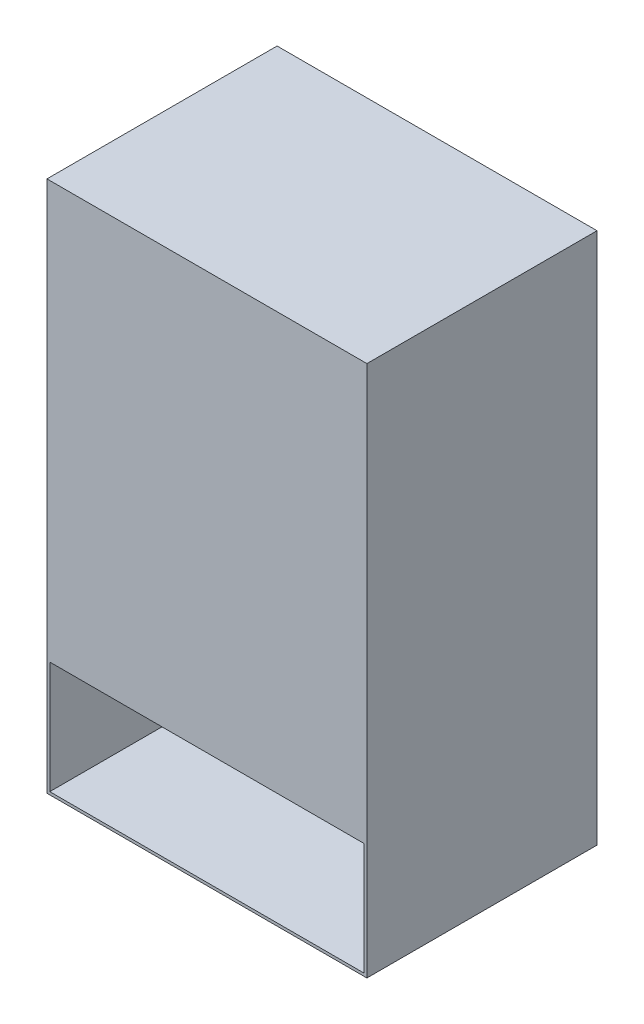
ISO-10303-21;
HEADER;
FILE_DESCRIPTION(('STEP AP214'),'2;1');
FILE_NAME('part.step','',(''),(''),'','','');
FILE_SCHEMA(('AUTOMOTIVE_DESIGN { 1 0 10303 214 1 1 1 1 }'));
ENDSEC;
DATA;
#1=APPLICATION_CONTEXT('core data for automotive mechanical design processes');
#2=APPLICATION_PROTOCOL_DEFINITION('international standard','automotive_design',2000,#1);
#3=PRODUCT_CONTEXT('',#1,'mechanical');
#4=PRODUCT('Part','Part','',(#3));
#5=PRODUCT_RELATED_PRODUCT_CATEGORY('part','',(#4));
#6=PRODUCT_DEFINITION_FORMATION('','',#4);
#7=PRODUCT_DEFINITION_CONTEXT('part definition',#1,'design');
#8=PRODUCT_DEFINITION('design','',#6,#7);
#9=PRODUCT_DEFINITION_SHAPE('','',#8);
#10=(LENGTH_UNIT() NAMED_UNIT(*) SI_UNIT(.MILLI.,.METRE.));
#11=(NAMED_UNIT(*) PLANE_ANGLE_UNIT() SI_UNIT($,.RADIAN.));
#12=(NAMED_UNIT(*) SI_UNIT($,.STERADIAN.) SOLID_ANGLE_UNIT());
#13=UNCERTAINTY_MEASURE_WITH_UNIT(LENGTH_MEASURE(1.E-05),#10,'distance_accuracy_value','');
#14=(GEOMETRIC_REPRESENTATION_CONTEXT(3) GLOBAL_UNCERTAINTY_ASSIGNED_CONTEXT((#13)) GLOBAL_UNIT_ASSIGNED_CONTEXT((#10,
#11,#12)) REPRESENTATION_CONTEXT('',''));
#15=CARTESIAN_POINT('',(0.,0.,0.));
#16=DIRECTION('',(0.,0.,1.));
#17=DIRECTION('',(1.,0.,0.));
#18=AXIS2_PLACEMENT_3D('',#15,#16,#17);
#19=CARTESIAN_POINT('',(0.,0.,-127.));
#20=DIRECTION('',(0.,0.,1.));
#21=DIRECTION('',(1.,0.,0.));
#22=AXIS2_PLACEMENT_3D('',#19,#20,#21);
#23=PLANE('',#22);
#24=DIRECTION('',(0.,1.,0.));
#25=VECTOR('',#24,1.);
#26=CARTESIAN_POINT('',(177.8,297.815,-127.));
#27=LINE('',#26,#25);
#28=CARTESIAN_POINT('',(177.8,-297.815,-127.));
#29=VERTEX_POINT('',#28);
#30=CARTESIAN_POINT('',(177.8,170.815,-127.));
#31=VERTEX_POINT('',#30);
#32=EDGE_CURVE('E129',#29,#31,#27,.T.);
#33=ORIENTED_EDGE('',*,*,#32,.T.);
#34=DIRECTION('',(-1.,0.,0.));
#35=VECTOR('',#34,1.);
#36=CARTESIAN_POINT('',(177.8,170.815,-127.));
#37=LINE('',#36,#35);
#38=CARTESIAN_POINT('',(-177.8,170.815,-127.));
#39=VERTEX_POINT('',#38);
#40=EDGE_CURVE('E132',#31,#39,#37,.T.);
#41=ORIENTED_EDGE('',*,*,#40,.T.);
#42=DIRECTION('',(0.,-1.,0.));
#43=VECTOR('',#42,1.);
#44=CARTESIAN_POINT('',(-177.8,297.815,-127.));
#45=LINE('',#44,#43);
#46=CARTESIAN_POINT('',(-177.8,-297.815,-127.));
#47=VERTEX_POINT('',#46);
#48=EDGE_CURVE('E146',#39,#47,#45,.T.);
#49=ORIENTED_EDGE('',*,*,#48,.T.);
#50=DIRECTION('',(1.,0.,0.));
#51=VECTOR('',#50,1.);
#52=CARTESIAN_POINT('',(-177.8,-297.815,-127.));
#53=LINE('',#52,#51);
#54=EDGE_CURVE('E140',#47,#29,#53,.T.);
#55=ORIENTED_EDGE('',*,*,#54,.T.);
#56=EDGE_LOOP('',(#33,#41,#49,#55));
#57=FACE_BOUND('',#56,.T.);
#58=ADVANCED_FACE('F37',(#57),#23,.T.);
#59=CARTESIAN_POINT('',(-180.975,300.99,130.175));
#60=DIRECTION('',(1.,0.,0.));
#61=DIRECTION('',(0.,0.,-1.));
#62=AXIS2_PLACEMENT_3D('',#59,#60,#61);
#63=PLANE('',#62);
#64=DIRECTION('',(0.,-1.,0.));
#65=VECTOR('',#64,1.);
#66=CARTESIAN_POINT('',(-180.975,300.99,-130.175));
#67=LINE('',#66,#65);
#68=CARTESIAN_POINT('',(-180.975,300.99,-130.175));
#69=VERTEX_POINT('',#68);
#70=CARTESIAN_POINT('',(-180.975,-300.99,-130.175));
#71=VERTEX_POINT('',#70);
#72=EDGE_CURVE('E174',#69,#71,#67,.T.);
#73=ORIENTED_EDGE('',*,*,#72,.T.);
#74=DIRECTION('',(0.,0.,-1.));
#75=VECTOR('',#74,1.);
#76=CARTESIAN_POINT('',(-180.975,-300.99,130.175));
#77=LINE('',#76,#75);
#78=CARTESIAN_POINT('',(-180.975,-300.99,130.175));
#79=VERTEX_POINT('',#78);
#80=EDGE_CURVE('E11',#79,#71,#77,.T.);
#81=ORIENTED_EDGE('',*,*,#80,.F.);
#82=DIRECTION('',(0.,-1.,0.));
#83=VECTOR('',#82,1.);
#84=CARTESIAN_POINT('',(-180.975,300.99,130.175));
#85=LINE('',#84,#83);
#86=CARTESIAN_POINT('',(-180.975,300.99,130.175));
#87=VERTEX_POINT('',#86);
#88=EDGE_CURVE('E181',#87,#79,#85,.T.);
#89=ORIENTED_EDGE('',*,*,#88,.F.);
#90=DIRECTION('',(0.,0.,-1.));
#91=VECTOR('',#90,1.);
#92=CARTESIAN_POINT('',(-180.975,300.99,130.175));
#93=LINE('',#92,#91);
#94=EDGE_CURVE('E191',#87,#69,#93,.T.);
#95=ORIENTED_EDGE('',*,*,#94,.T.);
#96=EDGE_LOOP('',(#73,#81,#89,#95));
#97=FACE_BOUND('',#96,.T.);
#98=ADVANCED_FACE('F39',(#97),#63,.F.);
#99=CARTESIAN_POINT('',(-180.975,-300.99,130.175));
#100=DIRECTION('',(0.,1.,0.));
#101=DIRECTION('',(0.,0.,1.));
#102=AXIS2_PLACEMENT_3D('',#99,#100,#101);
#103=PLANE('',#102);
#104=DIRECTION('',(1.,0.,0.));
#105=VECTOR('',#104,1.);
#106=CARTESIAN_POINT('',(-180.975,-300.99,-130.175));
#107=LINE('',#106,#105);
#108=CARTESIAN_POINT('',(180.975,-300.99,-130.175));
#109=VERTEX_POINT('',#108);
#110=EDGE_CURVE('E194',#71,#109,#107,.T.);
#111=ORIENTED_EDGE('',*,*,#110,.T.);
#112=DIRECTION('',(0.,0.,-1.));
#113=VECTOR('',#112,1.);
#114=CARTESIAN_POINT('',(180.975,-300.99,130.175));
#115=LINE('',#114,#113);
#116=CARTESIAN_POINT('',(180.975,-300.99,130.175));
#117=VERTEX_POINT('',#116);
#118=EDGE_CURVE('E45',#117,#109,#115,.T.);
#119=ORIENTED_EDGE('',*,*,#118,.F.);
#120=DIRECTION('',(1.,0.,0.));
#121=VECTOR('',#120,1.);
#122=CARTESIAN_POINT('',(-180.975,-300.99,130.175));
#123=LINE('',#122,#121);
#124=EDGE_CURVE('E184',#79,#117,#123,.T.);
#125=ORIENTED_EDGE('',*,*,#124,.F.);
#126=ORIENTED_EDGE('',*,*,#80,.T.);
#127=EDGE_LOOP('',(#111,#119,#125,#126));
#128=FACE_BOUND('',#127,.T.);
#129=ADVANCED_FACE('F224',(#128),#103,.F.);
#130=CARTESIAN_POINT('',(180.975,300.99,130.175));
#131=DIRECTION('',(-1.,0.,0.));
#132=DIRECTION('',(0.,-1.,0.));
#133=AXIS2_PLACEMENT_3D('',#130,#131,#132);
#134=PLANE('',#133);
#135=DIRECTION('',(0.,1.,0.));
#136=VECTOR('',#135,1.);
#137=CARTESIAN_POINT('',(180.975,300.99,-130.175));
#138=LINE('',#137,#136);
#139=CARTESIAN_POINT('',(180.975,300.99,-130.175));
#140=VERTEX_POINT('',#139);
#141=EDGE_CURVE('E196',#109,#140,#138,.T.);
#142=ORIENTED_EDGE('',*,*,#141,.T.);
#143=DIRECTION('',(0.,0.,-1.));
#144=VECTOR('',#143,1.);
#145=CARTESIAN_POINT('',(180.975,300.99,130.175));
#146=LINE('',#145,#144);
#147=CARTESIAN_POINT('',(180.975,300.99,130.175));
#148=VERTEX_POINT('',#147);
#149=EDGE_CURVE('E201',#148,#140,#146,.T.);
#150=ORIENTED_EDGE('',*,*,#149,.F.);
#151=DIRECTION('',(0.,1.,0.));
#152=VECTOR('',#151,1.);
#153=CARTESIAN_POINT('',(180.975,300.99,130.175));
#154=LINE('',#153,#152);
#155=EDGE_CURVE('E187',#117,#148,#154,.T.);
#156=ORIENTED_EDGE('',*,*,#155,.F.);
#157=ORIENTED_EDGE('',*,*,#118,.T.);
#158=EDGE_LOOP('',(#142,#150,#156,#157));
#159=FACE_BOUND('',#158,.T.);
#160=ADVANCED_FACE('F208',(#159),#134,.F.);
#161=CARTESIAN_POINT('',(-180.975,300.99,130.175));
#162=DIRECTION('',(0.,-1.,0.));
#163=DIRECTION('',(0.,0.,-1.));
#164=AXIS2_PLACEMENT_3D('',#161,#162,#163);
#165=PLANE('',#164);
#166=DIRECTION('',(-1.,0.,0.));
#167=VECTOR('',#166,1.);
#168=CARTESIAN_POINT('',(-180.975,300.99,-130.175));
#169=LINE('',#168,#167);
#170=EDGE_CURVE('E185',#140,#69,#169,.T.);
#171=ORIENTED_EDGE('',*,*,#170,.T.);
#172=ORIENTED_EDGE('',*,*,#94,.F.);
#173=DIRECTION('',(-1.,0.,0.));
#174=VECTOR('',#173,1.);
#175=CARTESIAN_POINT('',(-180.975,300.99,130.175));
#176=LINE('',#175,#174);
#177=EDGE_CURVE('E189',#148,#87,#176,.T.);
#178=ORIENTED_EDGE('',*,*,#177,.F.);
#179=ORIENTED_EDGE('',*,*,#149,.T.);
#180=EDGE_LOOP('',(#171,#172,#178,#179));
#181=FACE_BOUND('',#180,.T.);
#182=ADVANCED_FACE('F217',(#181),#165,.F.);
#183=CARTESIAN_POINT('',(0.,0.,130.175));
#184=DIRECTION('',(0.,0.,1.));
#185=DIRECTION('',(1.,0.,0.));
#186=AXIS2_PLACEMENT_3D('',#183,#184,#185);
#187=PLANE('',#186);
#188=DIRECTION('',(0.,-1.,0.));
#189=VECTOR('',#188,1.);
#190=CARTESIAN_POINT('',(-177.8,-170.815,130.175));
#191=LINE('',#190,#189);
#192=CARTESIAN_POINT('',(-177.8,-170.815,130.175));
#193=VERTEX_POINT('',#192);
#194=CARTESIAN_POINT('',(-177.8,-297.815,130.175));
#195=VERTEX_POINT('',#194);
#196=EDGE_CURVE('E158',#193,#195,#191,.T.);
#197=ORIENTED_EDGE('',*,*,#196,.F.);
#198=DIRECTION('',(-1.,0.,0.));
#199=VECTOR('',#198,1.);
#200=CARTESIAN_POINT('',(-177.8,-170.815,130.175));
#201=LINE('',#200,#199);
#202=CARTESIAN_POINT('',(177.8,-170.815,130.175));
#203=VERTEX_POINT('',#202);
#204=EDGE_CURVE('E163',#203,#193,#201,.T.);
#205=ORIENTED_EDGE('',*,*,#204,.F.);
#206=DIRECTION('',(0.,1.,0.));
#207=VECTOR('',#206,1.);
#208=CARTESIAN_POINT('',(177.8,-170.815,130.175));
#209=LINE('',#208,#207);
#210=CARTESIAN_POINT('',(177.8,-297.815,130.175));
#211=VERTEX_POINT('',#210);
#212=EDGE_CURVE('E168',#211,#203,#209,.T.);
#213=ORIENTED_EDGE('',*,*,#212,.F.);
#214=DIRECTION('',(1.,0.,0.));
#215=VECTOR('',#214,1.);
#216=CARTESIAN_POINT('',(-177.8,-297.815,130.175));
#217=LINE('',#216,#215);
#218=EDGE_CURVE('E165',#195,#211,#217,.T.);
#219=ORIENTED_EDGE('',*,*,#218,.F.);
#220=EDGE_LOOP('',(#197,#205,#213,#219));
#221=FACE_BOUND('',#220,.T.);
#222=ORIENTED_EDGE('',*,*,#88,.T.);
#223=ORIENTED_EDGE('',*,*,#124,.T.);
#224=ORIENTED_EDGE('',*,*,#155,.T.);
#225=ORIENTED_EDGE('',*,*,#177,.T.);
#226=EDGE_LOOP('',(#222,#223,#224,#225));
#227=FACE_BOUND('',#226,.T.);
#228=ADVANCED_FACE('F223',(#221,#227),#187,.T.);
#229=CARTESIAN_POINT('',(0.,0.,-130.175));
#230=DIRECTION('',(0.,0.,1.));
#231=DIRECTION('',(1.,0.,0.));
#232=AXIS2_PLACEMENT_3D('',#229,#230,#231);
#233=PLANE('',#232);
#234=DIRECTION('',(-1.,0.,0.));
#235=VECTOR('',#234,1.);
#236=CARTESIAN_POINT('',(177.8,170.815,-130.175));
#237=LINE('',#236,#235);
#238=CARTESIAN_POINT('',(177.8,170.815,-130.175));
#239=VERTEX_POINT('',#238);
#240=CARTESIAN_POINT('',(-177.8,170.815,-130.175));
#241=VERTEX_POINT('',#240);
#242=EDGE_CURVE('E366',#239,#241,#237,.T.);
#243=ORIENTED_EDGE('',*,*,#242,.F.);
#244=DIRECTION('',(0.,-1.,0.));
#245=VECTOR('',#244,1.);
#246=CARTESIAN_POINT('',(177.8,297.815,-130.175));
#247=LINE('',#246,#245);
#248=CARTESIAN_POINT('',(177.8,297.815,-130.175));
#249=VERTEX_POINT('',#248);
#250=EDGE_CURVE('E60',#249,#239,#247,.T.);
#251=ORIENTED_EDGE('',*,*,#250,.F.);
#252=DIRECTION('',(1.,0.,0.));
#253=VECTOR('',#252,1.);
#254=CARTESIAN_POINT('',(177.8,297.815,-130.175));
#255=LINE('',#254,#253);
#256=CARTESIAN_POINT('',(-177.8,297.815,-130.175));
#257=VERTEX_POINT('',#256);
#258=EDGE_CURVE('E137',#257,#249,#255,.T.);
#259=ORIENTED_EDGE('',*,*,#258,.F.);
#260=DIRECTION('',(0.,1.,0.));
#261=VECTOR('',#260,1.);
#262=CARTESIAN_POINT('',(-177.8,297.815,-130.175));
#263=LINE('',#262,#261);
#264=EDGE_CURVE('E369',#241,#257,#263,.T.);
#265=ORIENTED_EDGE('',*,*,#264,.F.);
#266=EDGE_LOOP('',(#243,#251,#259,#265));
#267=FACE_BOUND('',#266,.T.);
#268=ORIENTED_EDGE('',*,*,#72,.F.);
#269=ORIENTED_EDGE('',*,*,#170,.F.);
#270=ORIENTED_EDGE('',*,*,#141,.F.);
#271=ORIENTED_EDGE('',*,*,#110,.F.);
#272=EDGE_LOOP('',(#268,#269,#270,#271));
#273=FACE_BOUND('',#272,.T.);
#274=ADVANCED_FACE('F214',(#267,#273),#233,.F.);
#275=CARTESIAN_POINT('',(-177.8,-170.815,127.));
#276=DIRECTION('',(-1.,0.,0.));
#277=DIRECTION('',(0.,-1.,0.));
#278=AXIS2_PLACEMENT_3D('',#275,#276,#277);
#279=PLANE('',#278);
#280=ORIENTED_EDGE('',*,*,#196,.T.);
#281=DIRECTION('',(0.,0.,1.));
#282=VECTOR('',#281,1.);
#283=CARTESIAN_POINT('',(-177.8,-297.815,127.));
#284=LINE('',#283,#282);
#285=EDGE_CURVE('E162',#47,#195,#284,.T.);
#286=ORIENTED_EDGE('',*,*,#285,.F.);
#287=ORIENTED_EDGE('',*,*,#48,.F.);
#288=DIRECTION('',(0.,0.,-1.));
#289=VECTOR('',#288,1.);
#290=CARTESIAN_POINT('',(-177.8,170.815,-127.));
#291=LINE('',#290,#289);
#292=EDGE_CURVE('E52',#39,#241,#291,.T.);
#293=ORIENTED_EDGE('',*,*,#292,.T.);
#294=ORIENTED_EDGE('',*,*,#264,.T.);
#295=DIRECTION('',(0.,0.,1.));
#296=VECTOR('',#295,1.);
#297=CARTESIAN_POINT('',(-177.8,297.815,-127.));
#298=LINE('',#297,#296);
#299=CARTESIAN_POINT('',(-177.8,297.815,127.));
#300=VERTEX_POINT('',#299);
#301=EDGE_CURVE('E144',#257,#300,#298,.T.);
#302=ORIENTED_EDGE('',*,*,#301,.T.);
#303=DIRECTION('',(0.,-1.,0.));
#304=VECTOR('',#303,1.);
#305=CARTESIAN_POINT('',(-177.8,297.815,127.));
#306=LINE('',#305,#304);
#307=CARTESIAN_POINT('',(-177.8,-170.815,127.));
#308=VERTEX_POINT('',#307);
#309=EDGE_CURVE('E150',#300,#308,#306,.T.);
#310=ORIENTED_EDGE('',*,*,#309,.T.);
#311=DIRECTION('',(0.,0.,1.));
#312=VECTOR('',#311,1.);
#313=CARTESIAN_POINT('',(-177.8,-170.815,127.));
#314=LINE('',#313,#312);
#315=EDGE_CURVE('E172',#308,#193,#314,.T.);
#316=ORIENTED_EDGE('',*,*,#315,.T.);
#317=EDGE_LOOP('',(#280,#286,#287,#293,#294,#302,#310,#316));
#318=FACE_BOUND('',#317,.T.);
#319=ADVANCED_FACE('F249',(#318),#279,.F.);
#320=CARTESIAN_POINT('',(-177.8,-170.815,127.));
#321=DIRECTION('',(0.,1.,0.));
#322=DIRECTION('',(0.,0.,1.));
#323=AXIS2_PLACEMENT_3D('',#320,#321,#322);
#324=PLANE('',#323);
#325=ORIENTED_EDGE('',*,*,#204,.T.);
#326=ORIENTED_EDGE('',*,*,#315,.F.);
#327=DIRECTION('',(-1.,0.,0.));
#328=VECTOR('',#327,1.);
#329=CARTESIAN_POINT('',(-177.8,-170.815,127.));
#330=LINE('',#329,#328);
#331=CARTESIAN_POINT('',(177.8,-170.815,127.));
#332=VERTEX_POINT('',#331);
#333=EDGE_CURVE('E160',#332,#308,#330,.T.);
#334=ORIENTED_EDGE('',*,*,#333,.F.);
#335=DIRECTION('',(0.,0.,1.));
#336=VECTOR('',#335,1.);
#337=CARTESIAN_POINT('',(177.8,-170.815,127.));
#338=LINE('',#337,#336);
#339=EDGE_CURVE('E175',#332,#203,#338,.T.);
#340=ORIENTED_EDGE('',*,*,#339,.T.);
#341=EDGE_LOOP('',(#325,#326,#334,#340));
#342=FACE_BOUND('',#341,.T.);
#343=ADVANCED_FACE('F246',(#342),#324,.F.);
#344=CARTESIAN_POINT('',(177.8,-170.815,127.));
#345=DIRECTION('',(1.,0.,0.));
#346=DIRECTION('',(0.,0.,-1.));
#347=AXIS2_PLACEMENT_3D('',#344,#345,#346);
#348=PLANE('',#347);
#349=ORIENTED_EDGE('',*,*,#212,.T.);
#350=ORIENTED_EDGE('',*,*,#339,.F.);
#351=DIRECTION('',(0.,1.,0.));
#352=VECTOR('',#351,1.);
#353=CARTESIAN_POINT('',(177.8,297.815,127.));
#354=LINE('',#353,#352);
#355=CARTESIAN_POINT('',(177.8,297.815,127.));
#356=VERTEX_POINT('',#355);
#357=EDGE_CURVE('E153',#332,#356,#354,.T.);
#358=ORIENTED_EDGE('',*,*,#357,.T.);
#359=DIRECTION('',(0.,0.,1.));
#360=VECTOR('',#359,1.);
#361=CARTESIAN_POINT('',(177.8,297.815,-127.));
#362=LINE('',#361,#360);
#363=EDGE_CURVE('E141',#249,#356,#362,.T.);
#364=ORIENTED_EDGE('',*,*,#363,.F.);
#365=ORIENTED_EDGE('',*,*,#250,.T.);
#366=DIRECTION('',(0.,0.,-1.));
#367=VECTOR('',#366,1.);
#368=CARTESIAN_POINT('',(177.8,170.815,-127.));
#369=LINE('',#368,#367);
#370=EDGE_CURVE('E125',#31,#239,#369,.T.);
#371=ORIENTED_EDGE('',*,*,#370,.F.);
#372=ORIENTED_EDGE('',*,*,#32,.F.);
#373=DIRECTION('',(0.,0.,1.));
#374=VECTOR('',#373,1.);
#375=CARTESIAN_POINT('',(177.8,-297.815,127.));
#376=LINE('',#375,#374);
#377=EDGE_CURVE('E177',#29,#211,#376,.T.);
#378=ORIENTED_EDGE('',*,*,#377,.T.);
#379=EDGE_LOOP('',(#349,#350,#358,#364,#365,#371,#372,#378));
#380=FACE_BOUND('',#379,.T.);
#381=ADVANCED_FACE('F127',(#380),#348,.F.);
#382=CARTESIAN_POINT('',(-177.8,-297.815,127.));
#383=DIRECTION('',(0.,-1.,0.));
#384=DIRECTION('',(0.,0.,-1.));
#385=AXIS2_PLACEMENT_3D('',#382,#383,#384);
#386=PLANE('',#385);
#387=ORIENTED_EDGE('',*,*,#218,.T.);
#388=ORIENTED_EDGE('',*,*,#377,.F.);
#389=ORIENTED_EDGE('',*,*,#54,.F.);
#390=ORIENTED_EDGE('',*,*,#285,.T.);
#391=EDGE_LOOP('',(#387,#388,#389,#390));
#392=FACE_BOUND('',#391,.T.);
#393=ADVANCED_FACE('F244',(#392),#386,.F.);
#394=CARTESIAN_POINT('',(-177.8,297.815,-127.));
#395=DIRECTION('',(0.,1.,0.));
#396=DIRECTION('',(0.,0.,1.));
#397=AXIS2_PLACEMENT_3D('',#394,#395,#396);
#398=PLANE('',#397);
#399=DIRECTION('',(-1.,0.,0.));
#400=VECTOR('',#399,1.);
#401=CARTESIAN_POINT('',(-177.8,297.815,127.));
#402=LINE('',#401,#400);
#403=EDGE_CURVE('E155',#356,#300,#402,.T.);
#404=ORIENTED_EDGE('',*,*,#403,.T.);
#405=ORIENTED_EDGE('',*,*,#301,.F.);
#406=ORIENTED_EDGE('',*,*,#258,.T.);
#407=ORIENTED_EDGE('',*,*,#363,.T.);
#408=EDGE_LOOP('',(#404,#405,#406,#407));
#409=FACE_BOUND('',#408,.T.);
#410=ADVANCED_FACE('F240',(#409),#398,.F.);
#411=CARTESIAN_POINT('',(0.,0.,127.));
#412=DIRECTION('',(0.,0.,1.));
#413=DIRECTION('',(1.,0.,0.));
#414=AXIS2_PLACEMENT_3D('',#411,#412,#413);
#415=PLANE('',#414);
#416=ORIENTED_EDGE('',*,*,#333,.T.);
#417=ORIENTED_EDGE('',*,*,#309,.F.);
#418=ORIENTED_EDGE('',*,*,#403,.F.);
#419=ORIENTED_EDGE('',*,*,#357,.F.);
#420=EDGE_LOOP('',(#416,#417,#418,#419));
#421=FACE_BOUND('',#420,.T.);
#422=ADVANCED_FACE('F237',(#421),#415,.F.);
#423=CARTESIAN_POINT('',(177.8,170.815,-127.));
#424=DIRECTION('',(0.,-1.,0.));
#425=DIRECTION('',(0.,0.,-1.));
#426=AXIS2_PLACEMENT_3D('',#423,#424,#425);
#427=PLANE('',#426);
#428=ORIENTED_EDGE('',*,*,#242,.T.);
#429=ORIENTED_EDGE('',*,*,#292,.F.);
#430=ORIENTED_EDGE('',*,*,#40,.F.);
#431=ORIENTED_EDGE('',*,*,#370,.T.);
#432=EDGE_LOOP('',(#428,#429,#430,#431));
#433=FACE_BOUND('',#432,.T.);
#434=ADVANCED_FACE('F134',(#433),#427,.F.);
#435=CLOSED_SHELL('',(#58,#98,#129,#160,#182,#228,#274,#319,#343,#381,#393,#410,#422,#434));
#436=MANIFOLD_SOLID_BREP('B2',#435);
#437=ADVANCED_BREP_SHAPE_REPRESENTATION('',(#18,#436),#14);
#438=SHAPE_DEFINITION_REPRESENTATION(#9,#437);
ENDSEC;
END-ISO-10303-21;
